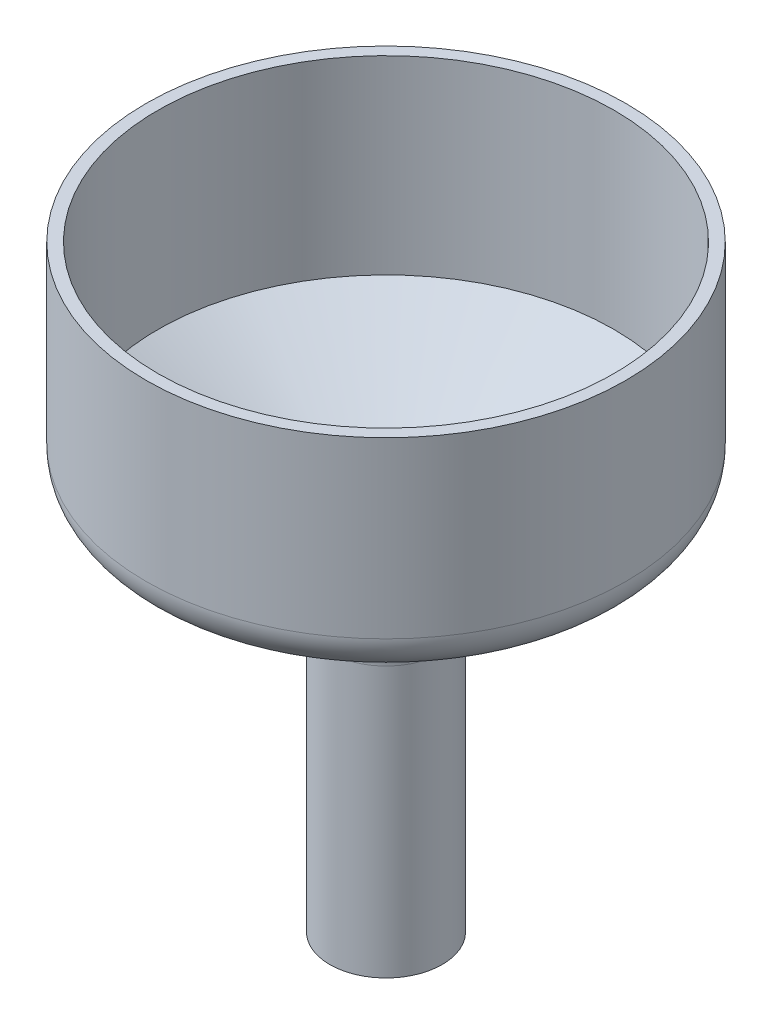
ISO-10303-21;
HEADER;
FILE_DESCRIPTION(('STEP AP214'),'2;1');
FILE_NAME('part.step','',(''),(''),'','','');
FILE_SCHEMA(('AUTOMOTIVE_DESIGN { 1 0 10303 214 1 1 1 1 }'));
ENDSEC;
DATA;
#1=APPLICATION_CONTEXT('core data for automotive mechanical design processes');
#2=APPLICATION_PROTOCOL_DEFINITION('international standard','automotive_design',2000,#1);
#3=PRODUCT_CONTEXT('',#1,'mechanical');
#4=PRODUCT('Part','Part','',(#3));
#5=PRODUCT_RELATED_PRODUCT_CATEGORY('part','',(#4));
#6=PRODUCT_DEFINITION_FORMATION('','',#4);
#7=PRODUCT_DEFINITION_CONTEXT('part definition',#1,'design');
#8=PRODUCT_DEFINITION('design','',#6,#7);
#9=PRODUCT_DEFINITION_SHAPE('','',#8);
#10=(LENGTH_UNIT() NAMED_UNIT(*) SI_UNIT(.MILLI.,.METRE.));
#11=(NAMED_UNIT(*) PLANE_ANGLE_UNIT() SI_UNIT($,.RADIAN.));
#12=(NAMED_UNIT(*) SI_UNIT($,.STERADIAN.) SOLID_ANGLE_UNIT());
#13=UNCERTAINTY_MEASURE_WITH_UNIT(LENGTH_MEASURE(1.E-05),#10,'distance_accuracy_value','');
#14=(GEOMETRIC_REPRESENTATION_CONTEXT(3) GLOBAL_UNCERTAINTY_ASSIGNED_CONTEXT((#13)) GLOBAL_UNIT_ASSIGNED_CONTEXT((#10,
#11,#12)) REPRESENTATION_CONTEXT('',''));
#15=CARTESIAN_POINT('',(0.,0.,0.));
#16=DIRECTION('',(0.,0.,1.));
#17=DIRECTION('',(1.,0.,0.));
#18=AXIS2_PLACEMENT_3D('',#15,#16,#17);
#19=CARTESIAN_POINT('',(0.,37.2,0.));
#20=DIRECTION('',(0.,-1.,0.));
#21=DIRECTION('',(0.,0.,-1.));
#22=AXIS2_PLACEMENT_3D('',#19,#20,#21);
#23=CYLINDRICAL_SURFACE('',#22,7.15);
#24=CARTESIAN_POINT('',(0.,34.3472604268313,0.));
#25=DIRECTION('',(0.,1.,0.));
#26=DIRECTION('',(0.,0.,1.));
#27=AXIS2_PLACEMENT_3D('',#24,#25,#26);
#28=CIRCLE('',#27,7.15);
#29=CARTESIAN_POINT('',(0.,34.3472604268313,7.15));
#30=VERTEX_POINT('',#29);
#31=EDGE_CURVE('E48',#30,#30,#28,.F.);
#32=ORIENTED_EDGE('',*,*,#31,.T.);
#33=EDGE_LOOP('',(#32));
#34=FACE_BOUND('',#33,.T.);
#35=CARTESIAN_POINT('',(0.,0.,0.));
#36=DIRECTION('',(0.,1.,0.));
#37=DIRECTION('',(0.,0.,1.));
#38=AXIS2_PLACEMENT_3D('',#35,#36,#37);
#39=CIRCLE('',#38,7.15);
#40=CARTESIAN_POINT('',(0.,0.,7.15));
#41=VERTEX_POINT('',#40);
#42=EDGE_CURVE('E61',#41,#41,#39,.T.);
#43=ORIENTED_EDGE('',*,*,#42,.T.);
#44=EDGE_LOOP('',(#43));
#45=FACE_BOUND('',#44,.T.);
#46=ADVANCED_FACE('F41',(#34,#45),#23,.T.);
#47=CARTESIAN_POINT('',(0.,0.,0.));
#48=DIRECTION('',(0.,1.,0.));
#49=DIRECTION('',(0.,0.,1.));
#50=AXIS2_PLACEMENT_3D('',#47,#48,#49);
#51=PLANE('',#50);
#52=CARTESIAN_POINT('',(0.,0.,0.));
#53=DIRECTION('',(0.,1.,0.));
#54=DIRECTION('',(0.,0.,1.));
#55=AXIS2_PLACEMENT_3D('',#52,#53,#54);
#56=CIRCLE('',#55,5.65);
#57=CARTESIAN_POINT('',(0.,0.,5.65));
#58=VERTEX_POINT('',#57);
#59=EDGE_CURVE('E72',#58,#58,#56,.T.);
#60=ORIENTED_EDGE('',*,*,#59,.T.);
#61=EDGE_LOOP('',(#60));
#62=FACE_BOUND('',#61,.T.);
#63=ORIENTED_EDGE('',*,*,#42,.F.);
#64=EDGE_LOOP('',(#63));
#65=FACE_BOUND('',#64,.T.);
#66=ADVANCED_FACE('F100',(#62,#65),#51,.F.);
#67=CARTESIAN_POINT('',(0.,37.2,0.));
#68=DIRECTION('',(0.,1.,0.));
#69=DIRECTION('',(0.,0.,1.));
#70=AXIS2_PLACEMENT_3D('',#67,#68,#69);
#71=CONICAL_SURFACE('',#70,7.14967396072295,1.0370221114711);
#72=CARTESIAN_POINT('',(0.,38.6517251176027,0.));
#73=DIRECTION('',(0.,-1.,0.));
#74=DIRECTION('',(0.,0.,-1.));
#75=AXIS2_PLACEMENT_3D('',#72,#73,#74);
#76=CIRCLE('',#75,9.6060692372035);
#77=CARTESIAN_POINT('',(0.,38.6517251176027,-9.6060692372035));
#78=VERTEX_POINT('',#77);
#79=EDGE_CURVE('E52',#78,#78,#76,.F.);
#80=ORIENTED_EDGE('',*,*,#79,.T.);
#81=EDGE_LOOP('',(#80));
#82=FACE_BOUND('',#81,.T.);
#83=CARTESIAN_POINT('',(0.,49.5484675710139,0.));
#84=DIRECTION('',(0.,1.,0.));
#85=DIRECTION('',(0.,0.,1.));
#86=AXIS2_PLACEMENT_3D('',#83,#84,#85);
#87=CIRCLE('',#86,28.0439307627965);
#88=CARTESIAN_POINT('',(0.,49.5484675710139,28.0439307627965));
#89=VERTEX_POINT('',#88);
#90=EDGE_CURVE('E56',#89,#89,#87,.F.);
#91=ORIENTED_EDGE('',*,*,#90,.T.);
#92=EDGE_LOOP('',(#91));
#93=FACE_BOUND('',#92,.T.);
#94=ADVANCED_FACE('F106',(#82,#93),#71,.T.);
#95=CARTESIAN_POINT('',(0.,76.,0.));
#96=DIRECTION('',(0.,-1.,0.));
#97=DIRECTION('',(0.,0.,-1.));
#98=AXIS2_PLACEMENT_3D('',#95,#96,#97);
#99=CYLINDRICAL_SURFACE('',#98,30.5);
#100=CARTESIAN_POINT('',(0.,53.8529322617853,0.));
#101=DIRECTION('',(0.,-1.,0.));
#102=DIRECTION('',(0.,0.,-1.));
#103=AXIS2_PLACEMENT_3D('',#100,#101,#102);
#104=CIRCLE('',#103,30.5);
#105=CARTESIAN_POINT('',(0.,53.8529322617853,-30.5));
#106=VERTEX_POINT('',#105);
#107=EDGE_CURVE('E11',#106,#106,#104,.F.);
#108=ORIENTED_EDGE('',*,*,#107,.T.);
#109=EDGE_LOOP('',(#108));
#110=FACE_BOUND('',#109,.T.);
#111=CARTESIAN_POINT('',(0.,76.,0.));
#112=DIRECTION('',(0.,1.,0.));
#113=DIRECTION('',(0.,0.,1.));
#114=AXIS2_PLACEMENT_3D('',#111,#112,#113);
#115=CIRCLE('',#114,30.5);
#116=CARTESIAN_POINT('',(0.,76.,30.5));
#117=VERTEX_POINT('',#116);
#118=EDGE_CURVE('E64',#117,#117,#115,.T.);
#119=ORIENTED_EDGE('',*,*,#118,.F.);
#120=EDGE_LOOP('',(#119));
#121=FACE_BOUND('',#120,.T.);
#122=ADVANCED_FACE('F112',(#110,#121),#99,.T.);
#123=CARTESIAN_POINT('',(0.,76.,0.));
#124=DIRECTION('',(0.,1.,0.));
#125=DIRECTION('',(0.,0.,1.));
#126=AXIS2_PLACEMENT_3D('',#123,#124,#125);
#127=PLANE('',#126);
#128=CARTESIAN_POINT('',(0.,76.,0.));
#129=DIRECTION('',(0.,1.,0.));
#130=DIRECTION('',(0.,0.,1.));
#131=AXIS2_PLACEMENT_3D('',#128,#129,#130);
#132=CIRCLE('',#131,29.);
#133=CARTESIAN_POINT('',(0.,76.,29.));
#134=VERTEX_POINT('',#133);
#135=EDGE_CURVE('E68',#134,#134,#132,.T.);
#136=ORIENTED_EDGE('',*,*,#135,.F.);
#137=EDGE_LOOP('',(#136));
#138=FACE_BOUND('',#137,.T.);
#139=ORIENTED_EDGE('',*,*,#118,.T.);
#140=EDGE_LOOP('',(#139));
#141=FACE_BOUND('',#140,.T.);
#142=ADVANCED_FACE('F115',(#138,#141),#127,.T.);
#143=CARTESIAN_POINT('',(0.,37.2,0.));
#144=DIRECTION('',(0.,-1.,0.));
#145=DIRECTION('',(0.,0.,-1.));
#146=AXIS2_PLACEMENT_3D('',#143,#144,#145);
#147=CYLINDRICAL_SURFACE('',#146,5.65);
#148=CARTESIAN_POINT('',(0.,38.0560723671523,0.));
#149=DIRECTION('',(0.,1.,0.));
#150=DIRECTION('',(0.,0.,1.));
#151=AXIS2_PLACEMENT_3D('',#148,#149,#150);
#152=CIRCLE('',#151,5.65);
#153=CARTESIAN_POINT('',(0.,38.0560723671523,5.64999999999999));
#154=VERTEX_POINT('',#153);
#155=EDGE_CURVE('E67',#154,#154,#152,.T.);
#156=ORIENTED_EDGE('',*,*,#155,.T.);
#157=EDGE_LOOP('',(#156));
#158=FACE_BOUND('',#157,.T.);
#159=ORIENTED_EDGE('',*,*,#59,.F.);
#160=EDGE_LOOP('',(#159));
#161=FACE_BOUND('',#160,.T.);
#162=ADVANCED_FACE('F80',(#158,#161),#147,.F.);
#163=CARTESIAN_POINT('',(0.,38.4913394072314,0.));
#164=DIRECTION('',(0.,1.,0.));
#165=DIRECTION('',(0.,0.,1.));
#166=AXIS2_PLACEMENT_3D('',#163,#164,#165);
#167=CONICAL_SURFACE('',#166,6.386494731884,1.0370221114711);
#168=CARTESIAN_POINT('',(0.,51.8558796785356,0.));
#169=DIRECTION('',(0.,1.,0.));
#170=DIRECTION('',(0.,0.,1.));
#171=AXIS2_PLACEMENT_3D('',#168,#169,#170);
#172=CIRCLE('',#171,29.);
#173=CARTESIAN_POINT('',(0.,51.8558796785356,29.));
#174=VERTEX_POINT('',#173);
#175=EDGE_CURVE('E71',#174,#174,#172,.T.);
#176=CARTESIAN_POINT('',(0.,38.0560723671523,5.64999999999999));
#177=CARTESIAN_POINT('',(0.,38.1998203599792,5.89322916666666));
#178=CARTESIAN_POINT('',(0.,38.3435683528061,6.13645833333332));
#179=CARTESIAN_POINT('',(0.,38.6310643384599,6.62291666666666));
#180=CARTESIAN_POINT('',(0.,38.7748123312868,6.86614583333332));
#181=CARTESIAN_POINT('',(0.,39.0623083169406,7.35260416666666));
#182=CARTESIAN_POINT('',(0.,39.2060563097675,7.59583333333332));
#183=CARTESIAN_POINT('',(0.,39.4935522954214,8.08229166666666));
#184=CARTESIAN_POINT('',(0.,39.6373002882483,8.32552083333332));
#185=CARTESIAN_POINT('',(0.,39.9247962739021,8.81197916666665));
#186=CARTESIAN_POINT('',(0.,40.068544266729,9.05520833333332));
#187=CARTESIAN_POINT('',(0.,40.3560402523828,9.54166666666666));
#188=CARTESIAN_POINT('',(0.,40.4997882452097,9.78489583333332));
#189=CARTESIAN_POINT('',(0.,40.7872842308635,10.2713541666667));
#190=CARTESIAN_POINT('',(0.,40.9310322236905,10.5145833333333));
#191=CARTESIAN_POINT('',(0.,41.2185282093443,11.0010416666667));
#192=CARTESIAN_POINT('',(0.,41.3622762021712,11.2442708333333));
#193=CARTESIAN_POINT('',(0.,41.649772187825,11.7307291666667));
#194=CARTESIAN_POINT('',(0.,41.7935201806519,11.9739583333333));
#195=CARTESIAN_POINT('',(0.,42.0810161663057,12.4604166666667));
#196=CARTESIAN_POINT('',(0.,42.2247641591326,12.7036458333333));
#197=CARTESIAN_POINT('',(0.,42.5122601447865,13.1901041666667));
#198=CARTESIAN_POINT('',(0.,42.6560081376134,13.4333333333333));
#199=CARTESIAN_POINT('',(0.,42.9435041232672,13.9197916666667));
#200=CARTESIAN_POINT('',(0.,43.0872521160941,14.1630208333333));
#201=CARTESIAN_POINT('',(0.,43.3747481017479,14.6494791666667));
#202=CARTESIAN_POINT('',(0.,43.5184960945748,14.8927083333333));
#203=CARTESIAN_POINT('',(0.,43.8059920802287,15.3791666666667));
#204=CARTESIAN_POINT('',(0.,43.9497400730556,15.6223958333333));
#205=CARTESIAN_POINT('',(0.,44.2372360587094,16.1088541666667));
#206=CARTESIAN_POINT('',(0.,44.3809840515363,16.3520833333333));
#207=CARTESIAN_POINT('',(0.,44.6684800371901,16.8385416666667));
#208=CARTESIAN_POINT('',(0.,44.812228030017,17.0817708333333));
#209=CARTESIAN_POINT('',(0.,45.0997240156708,17.5682291666667));
#210=CARTESIAN_POINT('',(0.,45.2434720084978,17.8114583333333));
#211=CARTESIAN_POINT('',(0.,45.5309679941516,18.2979166666667));
#212=CARTESIAN_POINT('',(0.,45.6747159869785,18.5411458333333));
#213=CARTESIAN_POINT('',(0.,45.9622119726323,19.0276041666667));
#214=CARTESIAN_POINT('',(0.,46.1059599654592,19.2708333333333));
#215=CARTESIAN_POINT('',(0.,46.393455951113,19.7572916666667));
#216=CARTESIAN_POINT('',(0.,46.5372039439399,20.0005208333333));
#217=CARTESIAN_POINT('',(0.,46.8246999295938,20.4869791666667));
#218=CARTESIAN_POINT('',(0.,46.9684479224207,20.7302083333333));
#219=CARTESIAN_POINT('',(0.,47.2559439080745,21.2166666666667));
#220=CARTESIAN_POINT('',(0.,47.3996919009014,21.4598958333333));
#221=CARTESIAN_POINT('',(0.,47.6871878865552,21.9463541666667));
#222=CARTESIAN_POINT('',(0.,47.8309358793821,22.1895833333333));
#223=CARTESIAN_POINT('',(0.,48.118431865036,22.6760416666667));
#224=CARTESIAN_POINT('',(0.,48.2621798578629,22.9192708333333));
#225=CARTESIAN_POINT('',(0.,48.5496758435167,23.4057291666667));
#226=CARTESIAN_POINT('',(0.,48.6934238363436,23.6489583333333));
#227=CARTESIAN_POINT('',(0.,48.9809198219974,24.1354166666667));
#228=CARTESIAN_POINT('',(0.,49.1246678148243,24.3786458333333));
#229=CARTESIAN_POINT('',(0.,49.4121638004781,24.8651041666667));
#230=CARTESIAN_POINT('',(0.,49.5559117933051,25.1083333333333));
#231=CARTESIAN_POINT('',(0.,49.8434077789589,25.5947916666667));
#232=CARTESIAN_POINT('',(0.,49.9871557717858,25.8380208333333));
#233=CARTESIAN_POINT('',(0.,50.2746517574396,26.3244791666667));
#234=CARTESIAN_POINT('',(0.,50.4183997502665,26.5677083333333));
#235=CARTESIAN_POINT('',(0.,50.7058957359203,27.0541666666667));
#236=CARTESIAN_POINT('',(0.,50.8496437287472,27.2973958333333));
#237=CARTESIAN_POINT('',(0.,51.1371397144011,27.7838541666667));
#238=CARTESIAN_POINT('',(0.,51.280887707228,28.0270833333333));
#239=CARTESIAN_POINT('',(0.,51.5683836928818,28.5135416666667));
#240=CARTESIAN_POINT('',(0.,51.7121316857087,28.7567708333333));
#241=CARTESIAN_POINT('',(0.,51.8558796785356,29.));
#242=B_SPLINE_CURVE_WITH_KNOTS('',3,(#176,#177,#178,#179,#180,#181,#182,#183,#184,#185,#186,
#187,#188,#189,#190,#191,#192,#193,#194,#195,#196,#197,#198,#199,#200,#201,#202,#203,#204,#205,
#206,#207,#208,#209,#210,#211,#212,#213,#214,#215,#216,#217,#218,#219,#220,#221,#222,#223,#224,
#225,#226,#227,#228,#229,#230,#231,#232,#233,#234,#235,#236,#237,#238,#239,#240,#241),
.UNSPECIFIED.,.F.,.F.,(4,2,2,2,2,2,2,2,2,2,2,2,2,2,2,2,2,2,2,2,2,2,2,2,2,2,2,2,2,2,2,2,4),(0.,
0.847593780435027,1.69518756087005,2.54278134130508,3.3903751217401,4.23796890217513,
5.08556268261015,5.93315646304518,6.7807502434802,7.62834402391523,8.47593780435025,
9.32353158478528,10.1711253652203,11.0187191456553,11.8663129260904,12.7139067065254,
13.5615004869604,14.4090942673954,15.2566880478305,16.1042818282655,16.9518756087005,
17.7994693891355,18.6470631695706,19.4946569500056,20.3422507304406,21.1898445108756,
22.0374382913107,22.8850320717457,23.7326258521807,24.5802196326157,25.4278134130508,
26.2754071934858,27.1230009739208),.UNSPECIFIED.);
#243=EDGE_CURVE('BSEAM83',#154,#174,#242,.T.);
#244=ORIENTED_EDGE('',*,*,#155,.F.);
#245=ORIENTED_EDGE('',*,*,#175,.T.);
#246=ORIENTED_EDGE('',*,*,#243,.T.);
#247=ORIENTED_EDGE('',*,*,#243,.F.);
#248=EDGE_LOOP('',(#244,#246,#245,#247));
#249=FACE_BOUND('',#248,.T.);
#250=ADVANCED_FACE('F83',(#249),#167,.F.);
#251=CARTESIAN_POINT('',(0.,76.,0.));
#252=DIRECTION('',(0.,-1.,0.));
#253=DIRECTION('',(0.,0.,-1.));
#254=AXIS2_PLACEMENT_3D('',#251,#252,#253);
#255=CYLINDRICAL_SURFACE('',#254,29.);
#256=ORIENTED_EDGE('',*,*,#135,.T.);
#257=EDGE_LOOP('',(#256));
#258=FACE_BOUND('',#257,.T.);
#259=ORIENTED_EDGE('',*,*,#175,.F.);
#260=EDGE_LOOP('',(#259));
#261=FACE_BOUND('',#260,.T.);
#262=ADVANCED_FACE('F86',(#258,#261),#255,.F.);
#263=CARTESIAN_POINT('',(0.,34.3472604268313,0.));
#264=DIRECTION('',(0.,1.,0.));
#265=DIRECTION('',(0.,0.,1.));
#266=AXIS2_PLACEMENT_3D('',#263,#264,#265);
#267=TOROIDAL_SURFACE('',#266,12.15,5.);
#268=ORIENTED_EDGE('',*,*,#31,.F.);
#269=EDGE_LOOP('',(#268));
#270=FACE_BOUND('',#269,.T.);
#271=ORIENTED_EDGE('',*,*,#79,.F.);
#272=EDGE_LOOP('',(#271));
#273=FACE_BOUND('',#272,.T.);
#274=ADVANCED_FACE('F91',(#270,#273),#267,.F.);
#275=CARTESIAN_POINT('',(0.,53.8529322617853,0.));
#276=DIRECTION('',(0.,-1.,0.));
#277=DIRECTION('',(0.,0.,-1.));
#278=AXIS2_PLACEMENT_3D('',#275,#276,#277);
#279=TOROIDAL_SURFACE('',#278,25.5,5.);
#280=ORIENTED_EDGE('',*,*,#90,.F.);
#281=EDGE_LOOP('',(#280));
#282=FACE_BOUND('',#281,.T.);
#283=ORIENTED_EDGE('',*,*,#107,.F.);
#284=EDGE_LOOP('',(#283));
#285=FACE_BOUND('',#284,.T.);
#286=ADVANCED_FACE('F43',(#282,#285),#279,.T.);
#287=CLOSED_SHELL('',(#46,#66,#94,#122,#142,#162,#250,#262,#274,#286));
#288=MANIFOLD_SOLID_BREP('B2',#287);
#289=ADVANCED_BREP_SHAPE_REPRESENTATION('',(#18,#288),#14);
#290=SHAPE_DEFINITION_REPRESENTATION(#9,#289);
ENDSEC;
END-ISO-10303-21;
